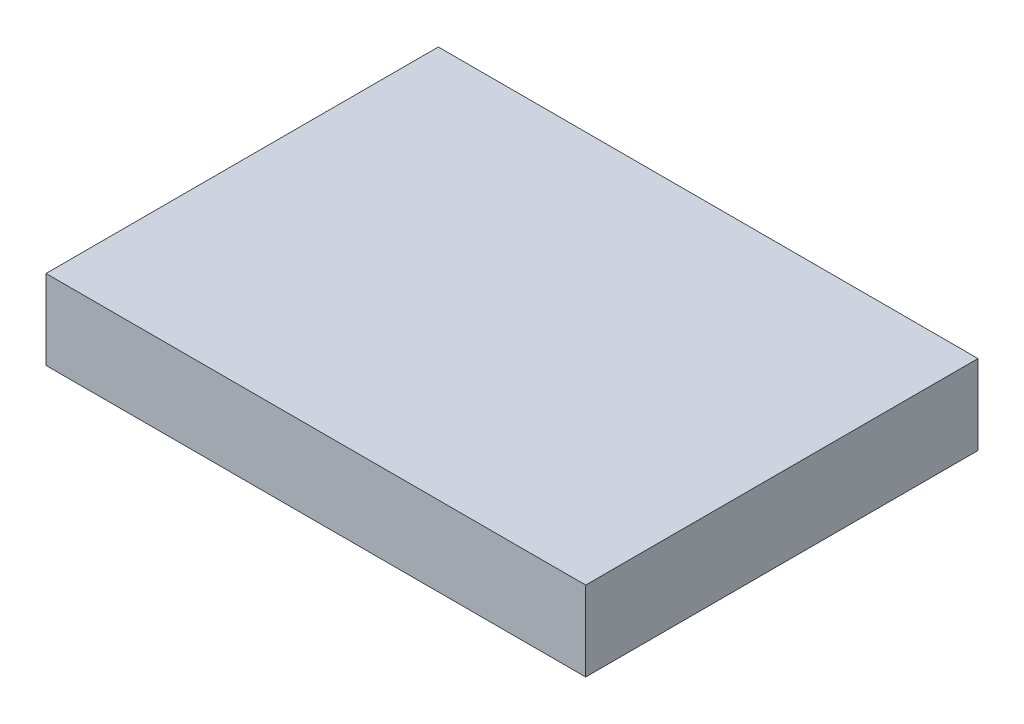
ISO-10303-21;
HEADER;
FILE_DESCRIPTION(('STEP AP214'),'2;1');
FILE_NAME('part.step','',(''),(''),'','','');
FILE_SCHEMA(('AUTOMOTIVE_DESIGN { 1 0 10303 214 1 1 1 1 }'));
ENDSEC;
DATA;
#1=APPLICATION_CONTEXT('core data for automotive mechanical design processes');
#2=APPLICATION_PROTOCOL_DEFINITION('international standard','automotive_design',2000,#1);
#3=PRODUCT_CONTEXT('',#1,'mechanical');
#4=PRODUCT('Part','Part','',(#3));
#5=PRODUCT_RELATED_PRODUCT_CATEGORY('part','',(#4));
#6=PRODUCT_DEFINITION_FORMATION('','',#4);
#7=PRODUCT_DEFINITION_CONTEXT('part definition',#1,'design');
#8=PRODUCT_DEFINITION('design','',#6,#7);
#9=PRODUCT_DEFINITION_SHAPE('','',#8);
#10=(LENGTH_UNIT() NAMED_UNIT(*) SI_UNIT(.MILLI.,.METRE.));
#11=(NAMED_UNIT(*) PLANE_ANGLE_UNIT() SI_UNIT($,.RADIAN.));
#12=(NAMED_UNIT(*) SI_UNIT($,.STERADIAN.) SOLID_ANGLE_UNIT());
#13=UNCERTAINTY_MEASURE_WITH_UNIT(LENGTH_MEASURE(1.E-05),#10,'distance_accuracy_value','');
#14=(GEOMETRIC_REPRESENTATION_CONTEXT(3) GLOBAL_UNCERTAINTY_ASSIGNED_CONTEXT((#13)) GLOBAL_UNIT_ASSIGNED_CONTEXT((#10,
#11,#12)) REPRESENTATION_CONTEXT('',''));
#15=CARTESIAN_POINT('',(0.,0.,0.));
#16=DIRECTION('',(0.,0.,1.));
#17=DIRECTION('',(1.,0.,0.));
#18=AXIS2_PLACEMENT_3D('',#15,#16,#17);
#19=CARTESIAN_POINT('',(0.,4.,0.));
#20=DIRECTION('',(1.,0.,0.));
#21=DIRECTION('',(0.,0.,-1.));
#22=AXIS2_PLACEMENT_3D('',#19,#20,#21);
#23=PLANE('',#22);
#24=DIRECTION('',(0.,0.,1.));
#25=VECTOR('',#24,1.);
#26=CARTESIAN_POINT('',(0.,0.,0.));
#27=LINE('',#26,#25);
#28=CARTESIAN_POINT('',(0.,0.,-19.7));
#29=VERTEX_POINT('',#28);
#30=CARTESIAN_POINT('',(0.,0.,0.));
#31=VERTEX_POINT('',#30);
#32=EDGE_CURVE('E107',#29,#31,#27,.T.);
#33=ORIENTED_EDGE('',*,*,#32,.T.);
#34=DIRECTION('',(0.,-1.,0.));
#35=VECTOR('',#34,1.);
#36=CARTESIAN_POINT('',(0.,4.,0.));
#37=LINE('',#36,#35);
#38=CARTESIAN_POINT('',(0.,4.,0.));
#39=VERTEX_POINT('',#38);
#40=EDGE_CURVE('E11',#39,#31,#37,.T.);
#41=ORIENTED_EDGE('',*,*,#40,.F.);
#42=DIRECTION('',(0.,0.,1.));
#43=VECTOR('',#42,1.);
#44=CARTESIAN_POINT('',(0.,4.,0.));
#45=LINE('',#44,#43);
#46=CARTESIAN_POINT('',(0.,4.,-19.7));
#47=VERTEX_POINT('',#46);
#48=EDGE_CURVE('E91',#47,#39,#45,.T.);
#49=ORIENTED_EDGE('',*,*,#48,.F.);
#50=DIRECTION('',(0.,-1.,0.));
#51=VECTOR('',#50,1.);
#52=CARTESIAN_POINT('',(0.,4.,-19.7));
#53=LINE('',#52,#51);
#54=EDGE_CURVE('E103',#47,#29,#53,.T.);
#55=ORIENTED_EDGE('',*,*,#54,.T.);
#56=EDGE_LOOP('',(#33,#41,#49,#55));
#57=FACE_BOUND('',#56,.T.);
#58=ADVANCED_FACE('F39',(#57),#23,.F.);
#59=CARTESIAN_POINT('',(0.,4.,0.));
#60=DIRECTION('',(0.,0.,-1.));
#61=DIRECTION('',(-1.,0.,0.));
#62=AXIS2_PLACEMENT_3D('',#59,#60,#61);
#63=PLANE('',#62);
#64=DIRECTION('',(1.,0.,0.));
#65=VECTOR('',#64,1.);
#66=CARTESIAN_POINT('',(0.,0.,0.));
#67=LINE('',#66,#65);
#68=CARTESIAN_POINT('',(27.1,0.,0.));
#69=VERTEX_POINT('',#68);
#70=EDGE_CURVE('E96',#31,#69,#67,.T.);
#71=ORIENTED_EDGE('',*,*,#70,.T.);
#72=DIRECTION('',(0.,-1.,0.));
#73=VECTOR('',#72,1.);
#74=CARTESIAN_POINT('',(27.1,4.,0.));
#75=LINE('',#74,#73);
#76=CARTESIAN_POINT('',(27.1,4.,0.));
#77=VERTEX_POINT('',#76);
#78=EDGE_CURVE('E48',#77,#69,#75,.T.);
#79=ORIENTED_EDGE('',*,*,#78,.F.);
#80=DIRECTION('',(1.,0.,0.));
#81=VECTOR('',#80,1.);
#82=CARTESIAN_POINT('',(0.,4.,0.));
#83=LINE('',#82,#81);
#84=EDGE_CURVE('E86',#39,#77,#83,.T.);
#85=ORIENTED_EDGE('',*,*,#84,.F.);
#86=ORIENTED_EDGE('',*,*,#40,.T.);
#87=EDGE_LOOP('',(#71,#79,#85,#86));
#88=FACE_BOUND('',#87,.T.);
#89=ADVANCED_FACE('F95',(#88),#63,.F.);
#90=CARTESIAN_POINT('',(27.1,4.,0.));
#91=DIRECTION('',(-1.,0.,0.));
#92=DIRECTION('',(0.,0.,1.));
#93=AXIS2_PLACEMENT_3D('',#90,#91,#92);
#94=PLANE('',#93);
#95=DIRECTION('',(0.,0.,-1.));
#96=VECTOR('',#95,1.);
#97=CARTESIAN_POINT('',(27.1,0.,0.));
#98=LINE('',#97,#96);
#99=CARTESIAN_POINT('',(27.1,0.,-19.7));
#100=VERTEX_POINT('',#99);
#101=EDGE_CURVE('E73',#69,#100,#98,.T.);
#102=ORIENTED_EDGE('',*,*,#101,.T.);
#103=DIRECTION('',(0.,-1.,0.));
#104=VECTOR('',#103,1.);
#105=CARTESIAN_POINT('',(27.1,4.,-19.7));
#106=LINE('',#105,#104);
#107=CARTESIAN_POINT('',(27.1,4.,-19.7));
#108=VERTEX_POINT('',#107);
#109=EDGE_CURVE('E98',#108,#100,#106,.T.);
#110=ORIENTED_EDGE('',*,*,#109,.F.);
#111=DIRECTION('',(0.,0.,-1.));
#112=VECTOR('',#111,1.);
#113=CARTESIAN_POINT('',(27.1,4.,0.));
#114=LINE('',#113,#112);
#115=EDGE_CURVE('E89',#77,#108,#114,.T.);
#116=ORIENTED_EDGE('',*,*,#115,.F.);
#117=ORIENTED_EDGE('',*,*,#78,.T.);
#118=EDGE_LOOP('',(#102,#110,#116,#117));
#119=FACE_BOUND('',#118,.T.);
#120=ADVANCED_FACE('F99',(#119),#94,.F.);
#121=CARTESIAN_POINT('',(0.,4.,-19.7));
#122=DIRECTION('',(0.,0.,1.));
#123=DIRECTION('',(1.,0.,0.));
#124=AXIS2_PLACEMENT_3D('',#121,#122,#123);
#125=PLANE('',#124);
#126=DIRECTION('',(-1.,0.,0.));
#127=VECTOR('',#126,1.);
#128=CARTESIAN_POINT('',(0.,0.,-19.7));
#129=LINE('',#128,#127);
#130=EDGE_CURVE('E79',#100,#29,#129,.T.);
#131=ORIENTED_EDGE('',*,*,#130,.T.);
#132=ORIENTED_EDGE('',*,*,#54,.F.);
#133=DIRECTION('',(-1.,0.,0.));
#134=VECTOR('',#133,1.);
#135=CARTESIAN_POINT('',(0.,4.,-19.7));
#136=LINE('',#135,#134);
#137=EDGE_CURVE('E56',#108,#47,#136,.T.);
#138=ORIENTED_EDGE('',*,*,#137,.F.);
#139=ORIENTED_EDGE('',*,*,#109,.T.);
#140=EDGE_LOOP('',(#131,#132,#138,#139));
#141=FACE_BOUND('',#140,.T.);
#142=ADVANCED_FACE('F120',(#141),#125,.F.);
#143=CARTESIAN_POINT('',(0.,4.,0.));
#144=DIRECTION('',(0.,-1.,0.));
#145=DIRECTION('',(0.,0.,-1.));
#146=AXIS2_PLACEMENT_3D('',#143,#144,#145);
#147=PLANE('',#146);
#148=ORIENTED_EDGE('',*,*,#48,.T.);
#149=ORIENTED_EDGE('',*,*,#84,.T.);
#150=ORIENTED_EDGE('',*,*,#115,.T.);
#151=ORIENTED_EDGE('',*,*,#137,.T.);
#152=EDGE_LOOP('',(#148,#149,#150,#151));
#153=FACE_BOUND('',#152,.T.);
#154=ADVANCED_FACE('F87',(#153),#147,.F.);
#155=CARTESIAN_POINT('',(0.,0.,0.));
#156=DIRECTION('',(0.,-1.,0.));
#157=DIRECTION('',(0.,0.,-1.));
#158=AXIS2_PLACEMENT_3D('',#155,#156,#157);
#159=PLANE('',#158);
#160=ORIENTED_EDGE('',*,*,#32,.F.);
#161=ORIENTED_EDGE('',*,*,#130,.F.);
#162=ORIENTED_EDGE('',*,*,#101,.F.);
#163=ORIENTED_EDGE('',*,*,#70,.F.);
#164=EDGE_LOOP('',(#160,#161,#162,#163));
#165=FACE_BOUND('',#164,.T.);
#166=ADVANCED_FACE('F123',(#165),#159,.T.);
#167=CLOSED_SHELL('',(#58,#89,#120,#142,#154,#166));
#168=MANIFOLD_SOLID_BREP('B2',#167);
#169=ADVANCED_BREP_SHAPE_REPRESENTATION('',(#18,#168),#14);
#170=SHAPE_DEFINITION_REPRESENTATION(#9,#169);
ENDSEC;
END-ISO-10303-21;
